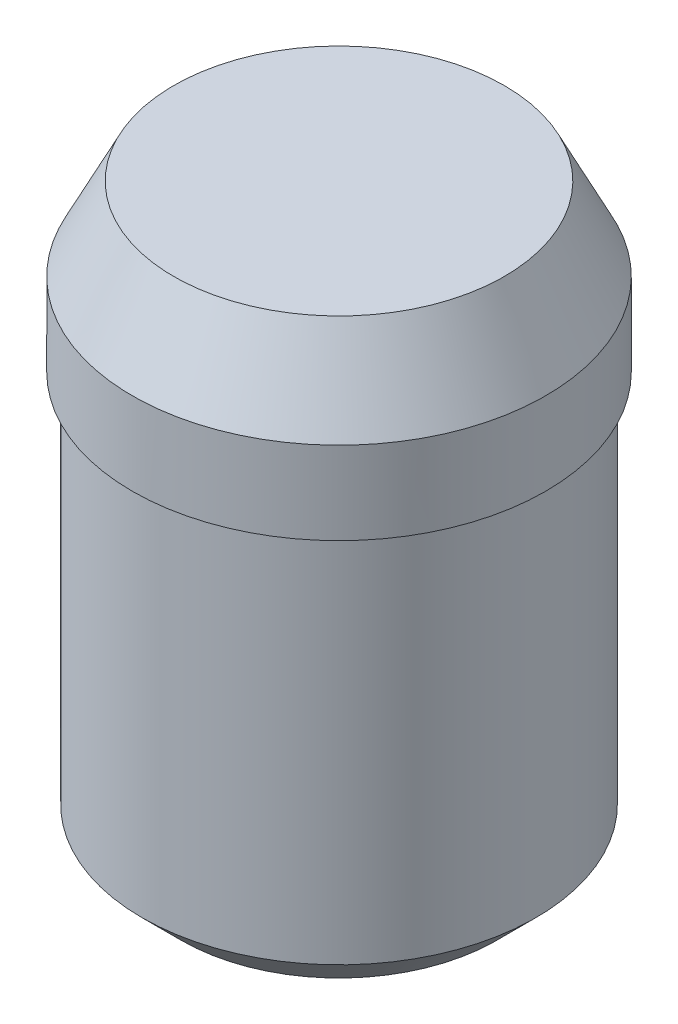
ISO-10303-21;
HEADER;
FILE_DESCRIPTION(('STEP AP214'),'2;1');
FILE_NAME('part.step','',(''),(''),'','','');
FILE_SCHEMA(('AUTOMOTIVE_DESIGN { 1 0 10303 214 1 1 1 1 }'));
ENDSEC;
DATA;
#1=APPLICATION_CONTEXT('core data for automotive mechanical design processes');
#2=APPLICATION_PROTOCOL_DEFINITION('international standard','automotive_design',2000,#1);
#3=PRODUCT_CONTEXT('',#1,'mechanical');
#4=PRODUCT('Part','Part','',(#3));
#5=PRODUCT_RELATED_PRODUCT_CATEGORY('part','',(#4));
#6=PRODUCT_DEFINITION_FORMATION('','',#4);
#7=PRODUCT_DEFINITION_CONTEXT('part definition',#1,'design');
#8=PRODUCT_DEFINITION('design','',#6,#7);
#9=PRODUCT_DEFINITION_SHAPE('','',#8);
#10=(LENGTH_UNIT() NAMED_UNIT(*) SI_UNIT(.MILLI.,.METRE.));
#11=(NAMED_UNIT(*) PLANE_ANGLE_UNIT() SI_UNIT($,.RADIAN.));
#12=(NAMED_UNIT(*) SI_UNIT($,.STERADIAN.) SOLID_ANGLE_UNIT());
#13=UNCERTAINTY_MEASURE_WITH_UNIT(LENGTH_MEASURE(1.E-05),#10,'distance_accuracy_value','');
#14=(GEOMETRIC_REPRESENTATION_CONTEXT(3) GLOBAL_UNCERTAINTY_ASSIGNED_CONTEXT((#13)) GLOBAL_UNIT_ASSIGNED_CONTEXT((#10,
#11,#12)) REPRESENTATION_CONTEXT('',''));
#15=CARTESIAN_POINT('',(0.,0.,0.));
#16=DIRECTION('',(0.,0.,1.));
#17=DIRECTION('',(1.,0.,0.));
#18=AXIS2_PLACEMENT_3D('',#15,#16,#17);
#19=CARTESIAN_POINT('',(0.,0.,0.));
#20=DIRECTION('',(0.,-1.,0.));
#21=DIRECTION('',(0.,0.,-1.));
#22=AXIS2_PLACEMENT_3D('',#19,#20,#21);
#23=CYLINDRICAL_SURFACE('',#22,5.);
#24=CARTESIAN_POINT('',(0.,10.,0.));
#25=DIRECTION('',(0.,1.,0.));
#26=DIRECTION('',(0.,0.,1.));
#27=AXIS2_PLACEMENT_3D('',#24,#25,#26);
#28=CIRCLE('',#27,5.);
#29=CARTESIAN_POINT('',(0.,10.,5.));
#30=VERTEX_POINT('',#29);
#31=EDGE_CURVE('E62',#30,#30,#28,.T.);
#32=ORIENTED_EDGE('',*,*,#31,.T.);
#33=EDGE_LOOP('',(#32));
#34=FACE_BOUND('',#33,.T.);
#35=CARTESIAN_POINT('',(0.,12.,0.));
#36=DIRECTION('',(0.,-1.,0.));
#37=DIRECTION('',(0.,0.,-1.));
#38=AXIS2_PLACEMENT_3D('',#35,#36,#37);
#39=CIRCLE('',#38,5.);
#40=CARTESIAN_POINT('',(0.,12.,-5.));
#41=VERTEX_POINT('',#40);
#42=EDGE_CURVE('E52',#41,#41,#39,.T.);
#43=ORIENTED_EDGE('',*,*,#42,.T.);
#44=EDGE_LOOP('',(#43));
#45=FACE_BOUND('',#44,.T.);
#46=ADVANCED_FACE('F45',(#34,#45),#23,.T.);
#47=CARTESIAN_POINT('',(0.,14.,0.));
#48=DIRECTION('',(0.,-1.,0.));
#49=DIRECTION('',(0.,0.,-1.));
#50=AXIS2_PLACEMENT_3D('',#47,#48,#49);
#51=PLANE('',#50);
#52=CARTESIAN_POINT('',(0.,14.,0.));
#53=DIRECTION('',(0.,-1.,0.));
#54=DIRECTION('',(0.,0.,-1.));
#55=AXIS2_PLACEMENT_3D('',#52,#53,#54);
#56=CIRCLE('',#55,4.);
#57=CARTESIAN_POINT('',(0.,14.,-4.));
#58=VERTEX_POINT('',#57);
#59=EDGE_CURVE('E10',#58,#58,#56,.T.);
#60=ORIENTED_EDGE('',*,*,#59,.F.);
#61=EDGE_LOOP('',(#60));
#62=FACE_BOUND('',#61,.T.);
#63=ADVANCED_FACE('F92',(#62),#51,.F.);
#64=CARTESIAN_POINT('',(0.,14.,0.));
#65=DIRECTION('',(0.,-1.,0.));
#66=DIRECTION('',(0.,0.,-1.));
#67=AXIS2_PLACEMENT_3D('',#64,#65,#66);
#68=CONICAL_SURFACE('',#67,4.,0.463647609000807);
#69=ORIENTED_EDGE('',*,*,#42,.F.);
#70=EDGE_LOOP('',(#69));
#71=FACE_BOUND('',#70,.T.);
#72=ORIENTED_EDGE('',*,*,#59,.T.);
#73=EDGE_LOOP('',(#72));
#74=FACE_BOUND('',#73,.T.);
#75=ADVANCED_FACE('F99',(#71,#74),#68,.T.);
#76=CARTESIAN_POINT('',(0.,0.,0.));
#77=DIRECTION('',(0.,1.,0.));
#78=DIRECTION('',(0.,0.,1.));
#79=AXIS2_PLACEMENT_3D('',#76,#77,#78);
#80=CYLINDRICAL_SURFACE('',#79,4.7625);
#81=CARTESIAN_POINT('',(0.,10.,0.));
#82=DIRECTION('',(0.,1.,0.));
#83=DIRECTION('',(0.,0.,1.));
#84=AXIS2_PLACEMENT_3D('',#81,#82,#83);
#85=CIRCLE('',#84,4.7625);
#86=CARTESIAN_POINT('',(0.,10.,4.7625));
#87=VERTEX_POINT('',#86);
#88=EDGE_CURVE('E57',#87,#87,#85,.T.);
#89=ORIENTED_EDGE('',*,*,#88,.F.);
#90=EDGE_LOOP('',(#89));
#91=FACE_BOUND('',#90,.T.);
#92=CARTESIAN_POINT('',(0.,0.946149999999986,0.));
#93=DIRECTION('',(0.,1.,0.));
#94=DIRECTION('',(0.,0.,1.));
#95=AXIS2_PLACEMENT_3D('',#92,#93,#94);
#96=CIRCLE('',#95,4.7625);
#97=CARTESIAN_POINT('',(0.,0.946149999999986,4.7625));
#98=VERTEX_POINT('',#97);
#99=EDGE_CURVE('E72',#98,#98,#96,.T.);
#100=ORIENTED_EDGE('',*,*,#99,.T.);
#101=EDGE_LOOP('',(#100));
#102=FACE_BOUND('',#101,.T.);
#103=ADVANCED_FACE('F77',(#91,#102),#80,.T.);
#104=CARTESIAN_POINT('',(4.7625,10.,0.));
#105=DIRECTION('',(0.,1.,0.));
#106=DIRECTION('',(0.,0.,1.));
#107=AXIS2_PLACEMENT_3D('',#104,#105,#106);
#108=PLANE('',#107);
#109=ORIENTED_EDGE('',*,*,#31,.F.);
#110=EDGE_LOOP('',(#109));
#111=FACE_BOUND('',#110,.T.);
#112=ORIENTED_EDGE('',*,*,#88,.T.);
#113=EDGE_LOOP('',(#112));
#114=FACE_BOUND('',#113,.T.);
#115=ADVANCED_FACE('F83',(#111,#114),#108,.F.);
#116=CARTESIAN_POINT('',(0.,0.,0.));
#117=DIRECTION('',(0.,1.,0.));
#118=DIRECTION('',(0.,0.,1.));
#119=AXIS2_PLACEMENT_3D('',#116,#117,#118);
#120=CONICAL_SURFACE('',#119,3.81635,0.785398163397455);
#121=ORIENTED_EDGE('',*,*,#99,.F.);
#122=EDGE_LOOP('',(#121));
#123=FACE_BOUND('',#122,.T.);
#124=CARTESIAN_POINT('',(0.,0.,0.));
#125=DIRECTION('',(0.,1.,0.));
#126=DIRECTION('',(0.,0.,1.));
#127=AXIS2_PLACEMENT_3D('',#124,#125,#126);
#128=CIRCLE('',#127,3.81635);
#129=CARTESIAN_POINT('',(0.,0.,3.81635));
#130=VERTEX_POINT('',#129);
#131=EDGE_CURVE('E68',#130,#130,#128,.T.);
#132=ORIENTED_EDGE('',*,*,#131,.T.);
#133=EDGE_LOOP('',(#132));
#134=FACE_BOUND('',#133,.T.);
#135=ADVANCED_FACE('F79',(#123,#134),#120,.T.);
#136=CARTESIAN_POINT('',(-5.,0.,0.));
#137=DIRECTION('',(0.,1.,0.));
#138=DIRECTION('',(0.,0.,1.));
#139=AXIS2_PLACEMENT_3D('',#136,#137,#138);
#140=PLANE('',#139);
#141=ORIENTED_EDGE('',*,*,#131,.F.);
#142=EDGE_LOOP('',(#141));
#143=FACE_BOUND('',#142,.T.);
#144=ADVANCED_FACE('F82',(#143),#140,.F.);
#145=CLOSED_SHELL('',(#46,#63,#75,#103,#115,#135,#144));
#146=MANIFOLD_SOLID_BREP('B2',#145);
#147=ADVANCED_BREP_SHAPE_REPRESENTATION('',(#18,#146),#14);
#148=SHAPE_DEFINITION_REPRESENTATION(#9,#147);
ENDSEC;
END-ISO-10303-21;
